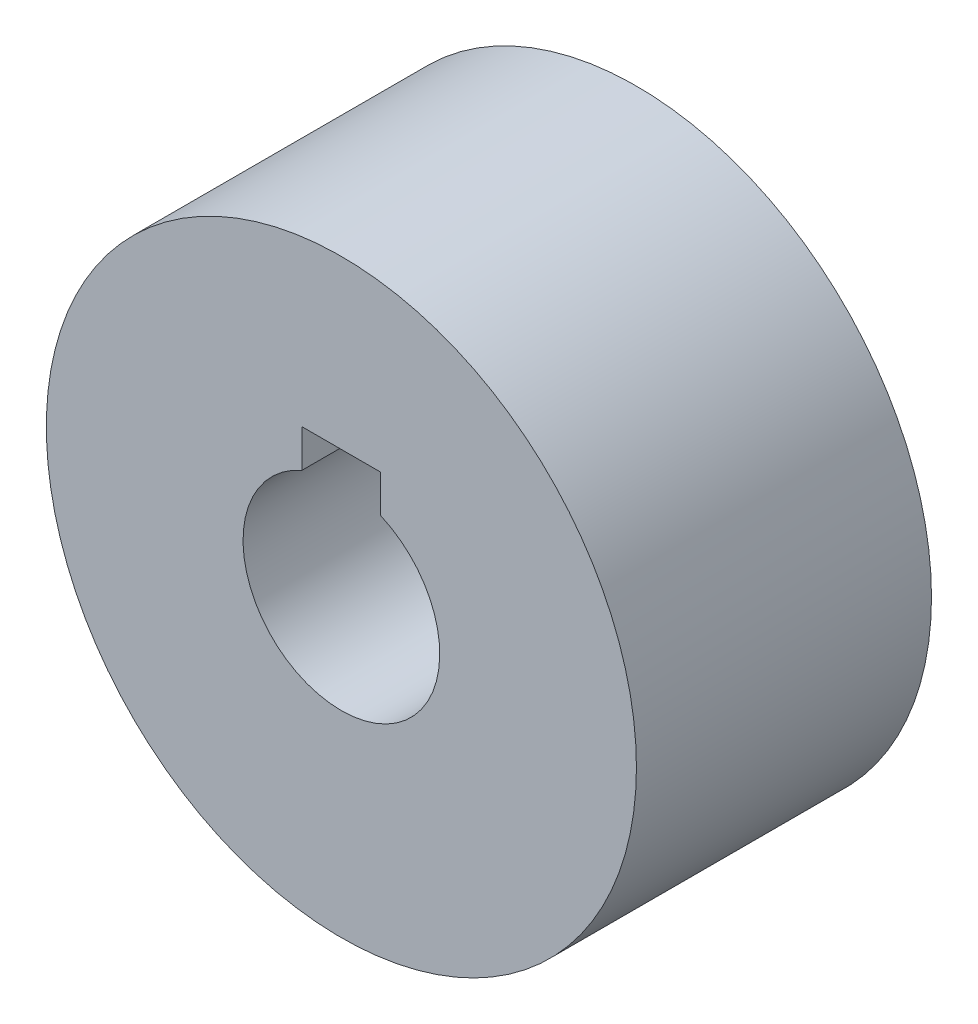
ISO-10303-21;
HEADER;
FILE_DESCRIPTION(('STEP AP214'),'2;1');
FILE_NAME('part.step','',(''),(''),'','','');
FILE_SCHEMA(('AUTOMOTIVE_DESIGN { 1 0 10303 214 1 1 1 1 }'));
ENDSEC;
DATA;
#1=APPLICATION_CONTEXT('core data for automotive mechanical design processes');
#2=APPLICATION_PROTOCOL_DEFINITION('international standard','automotive_design',2000,#1);
#3=PRODUCT_CONTEXT('',#1,'mechanical');
#4=PRODUCT('Part','Part','',(#3));
#5=PRODUCT_RELATED_PRODUCT_CATEGORY('part','',(#4));
#6=PRODUCT_DEFINITION_FORMATION('','',#4);
#7=PRODUCT_DEFINITION_CONTEXT('part definition',#1,'design');
#8=PRODUCT_DEFINITION('design','',#6,#7);
#9=PRODUCT_DEFINITION_SHAPE('','',#8);
#10=(LENGTH_UNIT() NAMED_UNIT(*) SI_UNIT(.MILLI.,.METRE.));
#11=(NAMED_UNIT(*) PLANE_ANGLE_UNIT() SI_UNIT($,.RADIAN.));
#12=(NAMED_UNIT(*) SI_UNIT($,.STERADIAN.) SOLID_ANGLE_UNIT());
#13=UNCERTAINTY_MEASURE_WITH_UNIT(LENGTH_MEASURE(1.E-05),#10,'distance_accuracy_value','');
#14=(GEOMETRIC_REPRESENTATION_CONTEXT(3) GLOBAL_UNCERTAINTY_ASSIGNED_CONTEXT((#13)) GLOBAL_UNIT_ASSIGNED_CONTEXT((#10,
#11,#12)) REPRESENTATION_CONTEXT('',''));
#15=CARTESIAN_POINT('',(0.,0.,0.));
#16=DIRECTION('',(0.,0.,1.));
#17=DIRECTION('',(1.,0.,0.));
#18=AXIS2_PLACEMENT_3D('',#15,#16,#17);
#19=CARTESIAN_POINT('',(0.,0.,30.));
#20=DIRECTION('',(0.,0.,1.));
#21=DIRECTION('',(1.,0.,0.));
#22=AXIS2_PLACEMENT_3D('',#19,#20,#21);
#23=PLANE('',#22);
#24=CARTESIAN_POINT('',(0.,0.,30.));
#25=DIRECTION('',(0.,0.,1.));
#26=DIRECTION('',(1.,0.,0.));
#27=AXIS2_PLACEMENT_3D('',#24,#25,#26);
#28=CIRCLE('',#27,30.);
#29=CARTESIAN_POINT('',(30.,0.,30.));
#30=VERTEX_POINT('',#29);
#31=EDGE_CURVE('E11',#30,#30,#28,.T.);
#32=ORIENTED_EDGE('',*,*,#31,.T.);
#33=EDGE_LOOP('',(#32));
#34=FACE_BOUND('',#33,.T.);
#35=DIRECTION('',(0.,1.,0.));
#36=VECTOR('',#35,1.);
#37=CARTESIAN_POINT('',(4.,9.16515138991168,30.));
#38=LINE('',#37,#36);
#39=CARTESIAN_POINT('',(4.,9.16515138991168,30.));
#40=VERTEX_POINT('',#39);
#41=CARTESIAN_POINT('',(4.,13.,30.));
#42=VERTEX_POINT('',#41);
#43=EDGE_CURVE('E82',#40,#42,#38,.T.);
#44=ORIENTED_EDGE('',*,*,#43,.F.);
#45=CARTESIAN_POINT('',(0.,0.,30.));
#46=DIRECTION('',(0.,0.,1.));
#47=DIRECTION('',(1.,0.,0.));
#48=AXIS2_PLACEMENT_3D('',#45,#46,#47);
#49=CIRCLE('',#48,10.);
#50=CARTESIAN_POINT('',(-4.,9.16515138991168,30.));
#51=VERTEX_POINT('',#50);
#52=EDGE_CURVE('E74',#51,#40,#49,.T.);
#53=ORIENTED_EDGE('',*,*,#52,.F.);
#54=DIRECTION('',(0.,-1.,0.));
#55=VECTOR('',#54,1.);
#56=CARTESIAN_POINT('',(-4.,13.,30.));
#57=LINE('',#56,#55);
#58=CARTESIAN_POINT('',(-4.,13.,30.));
#59=VERTEX_POINT('',#58);
#60=EDGE_CURVE('E95',#59,#51,#57,.T.);
#61=ORIENTED_EDGE('',*,*,#60,.F.);
#62=DIRECTION('',(-1.,0.,0.));
#63=VECTOR('',#62,1.);
#64=CARTESIAN_POINT('',(4.,13.,30.));
#65=LINE('',#64,#63);
#66=EDGE_CURVE('E93',#42,#59,#65,.T.);
#67=ORIENTED_EDGE('',*,*,#66,.F.);
#68=EDGE_LOOP('',(#44,#53,#61,#67));
#69=FACE_BOUND('',#68,.T.);
#70=ADVANCED_FACE('F33',(#34,#69),#23,.T.);
#71=CARTESIAN_POINT('',(0.,0.,0.));
#72=DIRECTION('',(0.,0.,1.));
#73=DIRECTION('',(1.,0.,0.));
#74=AXIS2_PLACEMENT_3D('',#71,#72,#73);
#75=PLANE('',#74);
#76=CARTESIAN_POINT('',(0.,0.,0.));
#77=DIRECTION('',(0.,0.,1.));
#78=DIRECTION('',(1.,0.,0.));
#79=AXIS2_PLACEMENT_3D('',#76,#77,#78);
#80=CIRCLE('',#79,30.);
#81=CARTESIAN_POINT('',(30.,0.,0.));
#82=VERTEX_POINT('',#81);
#83=EDGE_CURVE('E37',#82,#82,#80,.T.);
#84=ORIENTED_EDGE('',*,*,#83,.F.);
#85=EDGE_LOOP('',(#84));
#86=FACE_BOUND('',#85,.T.);
#87=CARTESIAN_POINT('',(0.,0.,0.));
#88=DIRECTION('',(0.,0.,1.));
#89=DIRECTION('',(1.,0.,0.));
#90=AXIS2_PLACEMENT_3D('',#87,#88,#89);
#91=CIRCLE('',#90,10.);
#92=CARTESIAN_POINT('',(-4.,9.16515138991168,0.));
#93=VERTEX_POINT('',#92);
#94=CARTESIAN_POINT('',(4.,9.16515138991168,0.));
#95=VERTEX_POINT('',#94);
#96=EDGE_CURVE('E56',#93,#95,#91,.T.);
#97=ORIENTED_EDGE('',*,*,#96,.T.);
#98=DIRECTION('',(0.,1.,0.));
#99=VECTOR('',#98,1.);
#100=CARTESIAN_POINT('',(4.,9.16515138991168,0.));
#101=LINE('',#100,#99);
#102=CARTESIAN_POINT('',(4.,13.,0.));
#103=VERTEX_POINT('',#102);
#104=EDGE_CURVE('E89',#95,#103,#101,.T.);
#105=ORIENTED_EDGE('',*,*,#104,.T.);
#106=DIRECTION('',(-1.,0.,0.));
#107=VECTOR('',#106,1.);
#108=CARTESIAN_POINT('',(4.,13.,0.));
#109=LINE('',#108,#107);
#110=CARTESIAN_POINT('',(-4.,13.,0.));
#111=VERTEX_POINT('',#110);
#112=EDGE_CURVE('E101',#103,#111,#109,.T.);
#113=ORIENTED_EDGE('',*,*,#112,.T.);
#114=DIRECTION('',(0.,-1.,0.));
#115=VECTOR('',#114,1.);
#116=CARTESIAN_POINT('',(-4.,13.,0.));
#117=LINE('',#116,#115);
#118=EDGE_CURVE('E83',#111,#93,#117,.T.);
#119=ORIENTED_EDGE('',*,*,#118,.T.);
#120=EDGE_LOOP('',(#97,#105,#113,#119));
#121=FACE_BOUND('',#120,.T.);
#122=ADVANCED_FACE('F112',(#86,#121),#75,.F.);
#123=CARTESIAN_POINT('',(0.,0.,30.));
#124=DIRECTION('',(0.,0.,-1.));
#125=DIRECTION('',(-1.,0.,0.));
#126=AXIS2_PLACEMENT_3D('',#123,#124,#125);
#127=CYLINDRICAL_SURFACE('',#126,30.);
#128=ORIENTED_EDGE('',*,*,#31,.F.);
#129=EDGE_LOOP('',(#128));
#130=FACE_BOUND('',#129,.T.);
#131=ORIENTED_EDGE('',*,*,#83,.T.);
#132=EDGE_LOOP('',(#131));
#133=FACE_BOUND('',#132,.T.);
#134=ADVANCED_FACE('F35',(#130,#133),#127,.T.);
#135=CARTESIAN_POINT('',(0.,0.,30.));
#136=DIRECTION('',(0.,0.,-1.));
#137=DIRECTION('',(-1.,0.,0.));
#138=AXIS2_PLACEMENT_3D('',#135,#136,#137);
#139=CYLINDRICAL_SURFACE('',#138,10.);
#140=ORIENTED_EDGE('',*,*,#96,.F.);
#141=DIRECTION('',(0.,0.,-1.));
#142=VECTOR('',#141,1.);
#143=CARTESIAN_POINT('',(-4.,9.16515138991168,30.));
#144=LINE('',#143,#142);
#145=EDGE_CURVE('E78',#51,#93,#144,.T.);
#146=ORIENTED_EDGE('',*,*,#145,.F.);
#147=ORIENTED_EDGE('',*,*,#52,.T.);
#148=DIRECTION('',(0.,0.,-1.));
#149=VECTOR('',#148,1.);
#150=CARTESIAN_POINT('',(4.,9.16515138991168,30.));
#151=LINE('',#150,#149);
#152=EDGE_CURVE('E77',#40,#95,#151,.T.);
#153=ORIENTED_EDGE('',*,*,#152,.T.);
#154=EDGE_LOOP('',(#140,#146,#147,#153));
#155=FACE_BOUND('',#154,.T.);
#156=ADVANCED_FACE('F76',(#155),#139,.F.);
#157=CARTESIAN_POINT('',(4.,9.16515138991168,30.));
#158=DIRECTION('',(-1.,0.,0.));
#159=DIRECTION('',(0.,-1.,0.));
#160=AXIS2_PLACEMENT_3D('',#157,#158,#159);
#161=PLANE('',#160);
#162=ORIENTED_EDGE('',*,*,#104,.F.);
#163=ORIENTED_EDGE('',*,*,#152,.F.);
#164=ORIENTED_EDGE('',*,*,#43,.T.);
#165=DIRECTION('',(0.,0.,-1.));
#166=VECTOR('',#165,1.);
#167=CARTESIAN_POINT('',(4.,13.,30.));
#168=LINE('',#167,#166);
#169=EDGE_CURVE('E90',#42,#103,#168,.T.);
#170=ORIENTED_EDGE('',*,*,#169,.T.);
#171=EDGE_LOOP('',(#162,#163,#164,#170));
#172=FACE_BOUND('',#171,.T.);
#173=ADVANCED_FACE('F86',(#172),#161,.T.);
#174=CARTESIAN_POINT('',(4.,13.,30.));
#175=DIRECTION('',(0.,-1.,0.));
#176=DIRECTION('',(0.,0.,-1.));
#177=AXIS2_PLACEMENT_3D('',#174,#175,#176);
#178=PLANE('',#177);
#179=ORIENTED_EDGE('',*,*,#112,.F.);
#180=ORIENTED_EDGE('',*,*,#169,.F.);
#181=ORIENTED_EDGE('',*,*,#66,.T.);
#182=DIRECTION('',(0.,0.,-1.));
#183=VECTOR('',#182,1.);
#184=CARTESIAN_POINT('',(-4.,13.,30.));
#185=LINE('',#184,#183);
#186=EDGE_CURVE('E48',#59,#111,#185,.T.);
#187=ORIENTED_EDGE('',*,*,#186,.T.);
#188=EDGE_LOOP('',(#179,#180,#181,#187));
#189=FACE_BOUND('',#188,.T.);
#190=ADVANCED_FACE('F110',(#189),#178,.T.);
#191=CARTESIAN_POINT('',(-4.,13.,30.));
#192=DIRECTION('',(1.,0.,0.));
#193=DIRECTION('',(0.,1.,0.));
#194=AXIS2_PLACEMENT_3D('',#191,#192,#193);
#195=PLANE('',#194);
#196=ORIENTED_EDGE('',*,*,#118,.F.);
#197=ORIENTED_EDGE('',*,*,#186,.F.);
#198=ORIENTED_EDGE('',*,*,#60,.T.);
#199=ORIENTED_EDGE('',*,*,#145,.T.);
#200=EDGE_LOOP('',(#196,#197,#198,#199));
#201=FACE_BOUND('',#200,.T.);
#202=ADVANCED_FACE('F113',(#201),#195,.T.);
#203=CLOSED_SHELL('',(#70,#122,#134,#156,#173,#190,#202));
#204=MANIFOLD_SOLID_BREP('B2',#203);
#205=ADVANCED_BREP_SHAPE_REPRESENTATION('',(#18,#204),#14);
#206=SHAPE_DEFINITION_REPRESENTATION(#9,#205);
ENDSEC;
END-ISO-10303-21;
